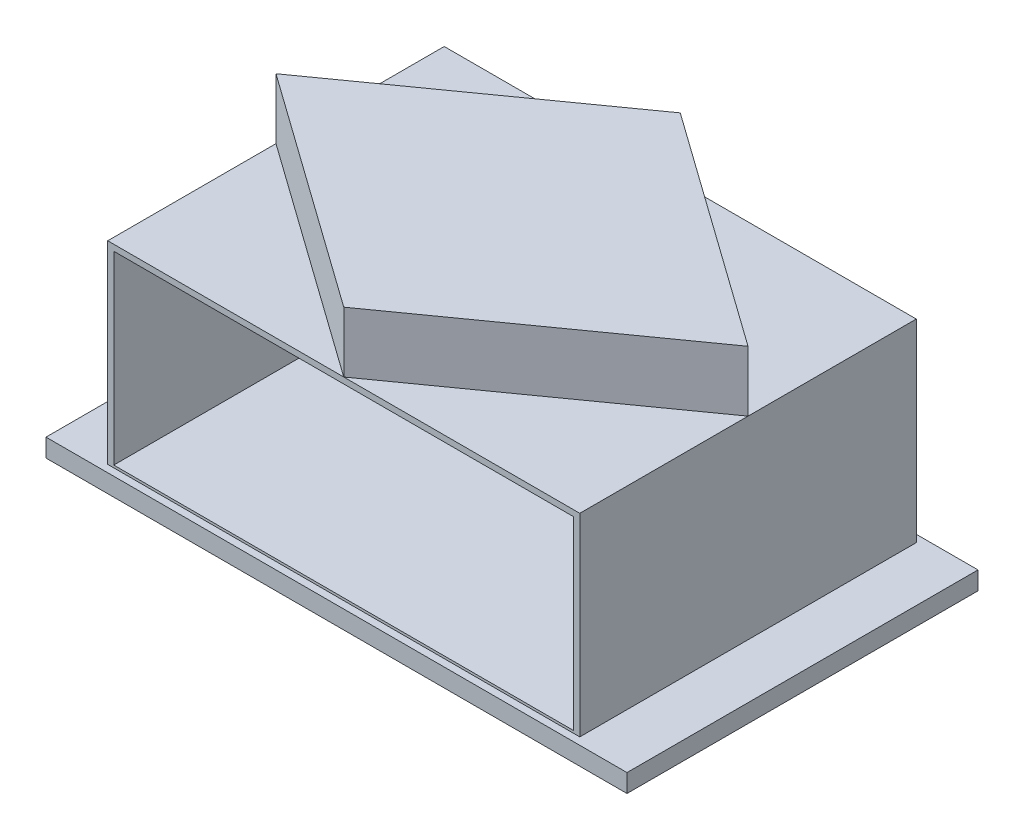
ISO-10303-21;
HEADER;
FILE_DESCRIPTION(('STEP AP214'),'2;1');
FILE_NAME('part.step','',(''),(''),'','','');
FILE_SCHEMA(('AUTOMOTIVE_DESIGN { 1 0 10303 214 1 1 1 1 }'));
ENDSEC;
DATA;
#1=APPLICATION_CONTEXT('core data for automotive mechanical design processes');
#2=APPLICATION_PROTOCOL_DEFINITION('international standard','automotive_design',2000,#1);
#3=PRODUCT_CONTEXT('',#1,'mechanical');
#4=PRODUCT('Part','Part','',(#3));
#5=PRODUCT_RELATED_PRODUCT_CATEGORY('part','',(#4));
#6=PRODUCT_DEFINITION_FORMATION('','',#4);
#7=PRODUCT_DEFINITION_CONTEXT('part definition',#1,'design');
#8=PRODUCT_DEFINITION('design','',#6,#7);
#9=PRODUCT_DEFINITION_SHAPE('','',#8);
#10=(LENGTH_UNIT() NAMED_UNIT(*) SI_UNIT(.MILLI.,.METRE.));
#11=(NAMED_UNIT(*) PLANE_ANGLE_UNIT() SI_UNIT($,.RADIAN.));
#12=(NAMED_UNIT(*) SI_UNIT($,.STERADIAN.) SOLID_ANGLE_UNIT());
#13=UNCERTAINTY_MEASURE_WITH_UNIT(LENGTH_MEASURE(1.E-05),#10,'distance_accuracy_value','');
#14=(GEOMETRIC_REPRESENTATION_CONTEXT(3) GLOBAL_UNCERTAINTY_ASSIGNED_CONTEXT((#13)) GLOBAL_UNIT_ASSIGNED_CONTEXT((#10,
#11,#12)) REPRESENTATION_CONTEXT('',''));
#15=CARTESIAN_POINT('',(0.,0.,0.));
#16=DIRECTION('',(0.,0.,1.));
#17=DIRECTION('',(1.,0.,0.));
#18=AXIS2_PLACEMENT_3D('',#15,#16,#17);
#19=CARTESIAN_POINT('',(0.,160.,0.));
#20=DIRECTION('',(0.,-1.,0.));
#21=DIRECTION('',(0.,0.,-1.));
#22=AXIS2_PLACEMENT_3D('',#19,#20,#21);
#23=PLANE('',#22);
#24=DIRECTION('',(-0.814297396356069,0.,-0.580447887658942));
#25=VECTOR('',#24,1.);
#26=CARTESIAN_POINT('',(195.,160.,0.));
#27=LINE('',#26,#25);
#28=CARTESIAN_POINT('',(195.,160.,0.));
#29=VERTEX_POINT('',#28);
#30=CARTESIAN_POINT('',(0.,160.,-139.));
#31=VERTEX_POINT('',#30);
#32=EDGE_CURVE('E179',#29,#31,#27,.T.);
#33=ORIENTED_EDGE('',*,*,#32,.F.);
#34=DIRECTION('',(0.,0.,-1.));
#35=VECTOR('',#34,1.);
#36=CARTESIAN_POINT('',(195.,160.,39.));
#37=LINE('',#36,#35);
#38=CARTESIAN_POINT('',(195.,160.,-139.));
#39=VERTEX_POINT('',#38);
#40=EDGE_CURVE('E234',#29,#39,#37,.T.);
#41=ORIENTED_EDGE('',*,*,#40,.T.);
#42=DIRECTION('',(-1.,0.,0.));
#43=VECTOR('',#42,1.);
#44=CARTESIAN_POINT('',(-195.,160.,-139.));
#45=LINE('',#44,#43);
#46=EDGE_CURVE('E235',#39,#31,#45,.T.);
#47=ORIENTED_EDGE('',*,*,#46,.T.);
#48=EDGE_LOOP('',(#33,#41,#47));
#49=FACE_BOUND('',#48,.T.);
#50=ADVANCED_FACE('F41',(#49),#23,.F.);
#51=DIRECTION('',(0.814297396356069,0.,-0.580447887658942));
#52=VECTOR('',#51,1.);
#53=CARTESIAN_POINT('',(0.,160.,139.));
#54=LINE('',#53,#52);
#55=CARTESIAN_POINT('',(1.11022302462516E-13,160.,139.));
#56=VERTEX_POINT('',#55);
#57=EDGE_CURVE('E58',#56,#29,#54,.T.);
#58=ORIENTED_EDGE('',*,*,#57,.F.);
#59=DIRECTION('',(-1.,0.,0.));
#60=VECTOR('',#59,1.);
#61=CARTESIAN_POINT('',(195.,160.,139.));
#62=LINE('',#61,#60);
#63=CARTESIAN_POINT('',(195.,160.,139.));
#64=VERTEX_POINT('',#63);
#65=EDGE_CURVE('E218',#64,#56,#62,.T.);
#66=ORIENTED_EDGE('',*,*,#65,.F.);
#67=EDGE_CURVE('E231',#64,#29,#37,.T.);
#68=ORIENTED_EDGE('',*,*,#67,.T.);
#69=EDGE_LOOP('',(#58,#66,#68));
#70=FACE_BOUND('',#69,.T.);
#71=ADVANCED_FACE('F307',(#70),#23,.F.);
#72=DIRECTION('',(0.814297396356069,0.,0.580447887658942));
#73=VECTOR('',#72,1.);
#74=CARTESIAN_POINT('',(-195.,160.,0.));
#75=LINE('',#74,#73);
#76=CARTESIAN_POINT('',(-195.,160.,0.));
#77=VERTEX_POINT('',#76);
#78=EDGE_CURVE('E331',#77,#56,#75,.T.);
#79=ORIENTED_EDGE('',*,*,#78,.F.);
#80=DIRECTION('',(0.,0.,1.));
#81=VECTOR('',#80,1.);
#82=CARTESIAN_POINT('',(-195.,160.,39.));
#83=LINE('',#82,#81);
#84=CARTESIAN_POINT('',(-195.,160.,139.));
#85=VERTEX_POINT('',#84);
#86=EDGE_CURVE('E238',#77,#85,#83,.T.);
#87=ORIENTED_EDGE('',*,*,#86,.T.);
#88=EDGE_CURVE('E211',#56,#85,#62,.T.);
#89=ORIENTED_EDGE('',*,*,#88,.F.);
#90=EDGE_LOOP('',(#79,#87,#89));
#91=FACE_BOUND('',#90,.T.);
#92=ADVANCED_FACE('F315',(#91),#23,.F.);
#93=DIRECTION('',(-0.814297396356069,0.,0.580447887658942));
#94=VECTOR('',#93,1.);
#95=CARTESIAN_POINT('',(0.,160.,-139.));
#96=LINE('',#95,#94);
#97=EDGE_CURVE('E66',#31,#77,#96,.T.);
#98=ORIENTED_EDGE('',*,*,#97,.F.);
#99=CARTESIAN_POINT('',(-195.,160.,-139.));
#100=VERTEX_POINT('',#99);
#101=EDGE_CURVE('E233',#31,#100,#45,.T.);
#102=ORIENTED_EDGE('',*,*,#101,.T.);
#103=EDGE_CURVE('E239',#100,#77,#83,.T.);
#104=ORIENTED_EDGE('',*,*,#103,.T.);
#105=EDGE_LOOP('',(#98,#102,#104));
#106=FACE_BOUND('',#105,.T.);
#107=ADVANCED_FACE('F310',(#106),#23,.F.);
#108=CARTESIAN_POINT('',(0.,0.,0.));
#109=DIRECTION('',(0.,-1.,0.));
#110=DIRECTION('',(0.,0.,-1.));
#111=AXIS2_PLACEMENT_3D('',#108,#109,#110);
#112=PLANE('',#111);
#113=DIRECTION('',(0.,0.,-1.));
#114=VECTOR('',#113,1.);
#115=CARTESIAN_POINT('',(240.,0.,145.));
#116=LINE('',#115,#114);
#117=CARTESIAN_POINT('',(240.,0.,145.));
#118=VERTEX_POINT('',#117);
#119=CARTESIAN_POINT('',(240.,0.,-145.));
#120=VERTEX_POINT('',#119);
#121=EDGE_CURVE('E254',#118,#120,#116,.T.);
#122=ORIENTED_EDGE('',*,*,#121,.T.);
#123=DIRECTION('',(-1.,0.,0.));
#124=VECTOR('',#123,1.);
#125=CARTESIAN_POINT('',(-240.,0.,-145.));
#126=LINE('',#125,#124);
#127=CARTESIAN_POINT('',(-240.,0.,-145.));
#128=VERTEX_POINT('',#127);
#129=EDGE_CURVE('E270',#120,#128,#126,.T.);
#130=ORIENTED_EDGE('',*,*,#129,.T.);
#131=DIRECTION('',(0.,0.,1.));
#132=VECTOR('',#131,1.);
#133=CARTESIAN_POINT('',(-240.,0.,145.));
#134=LINE('',#133,#132);
#135=CARTESIAN_POINT('',(-240.,0.,145.));
#136=VERTEX_POINT('',#135);
#137=EDGE_CURVE('E273',#128,#136,#134,.T.);
#138=ORIENTED_EDGE('',*,*,#137,.T.);
#139=DIRECTION('',(1.,0.,0.));
#140=VECTOR('',#139,1.);
#141=CARTESIAN_POINT('',(-240.,0.,145.));
#142=LINE('',#141,#140);
#143=EDGE_CURVE('E259',#136,#118,#142,.T.);
#144=ORIENTED_EDGE('',*,*,#143,.T.);
#145=EDGE_LOOP('',(#122,#130,#138,#144));
#146=FACE_BOUND('',#145,.T.);
#147=DIRECTION('',(1.,0.,0.));
#148=VECTOR('',#147,1.);
#149=CARTESIAN_POINT('',(-195.,0.,139.));
#150=LINE('',#149,#148);
#151=CARTESIAN_POINT('',(-195.,0.,139.));
#152=VERTEX_POINT('',#151);
#153=CARTESIAN_POINT('',(195.,0.,139.));
#154=VERTEX_POINT('',#153);
#155=EDGE_CURVE('E224',#152,#154,#150,.T.);
#156=ORIENTED_EDGE('',*,*,#155,.F.);
#157=DIRECTION('',(0.,0.,1.));
#158=VECTOR('',#157,1.);
#159=CARTESIAN_POINT('',(-195.,0.,39.));
#160=LINE('',#159,#158);
#161=CARTESIAN_POINT('',(-195.,0.,-139.));
#162=VERTEX_POINT('',#161);
#163=EDGE_CURVE('E247',#162,#152,#160,.T.);
#164=ORIENTED_EDGE('',*,*,#163,.F.);
#165=DIRECTION('',(-1.,0.,0.));
#166=VECTOR('',#165,1.);
#167=CARTESIAN_POINT('',(-195.,0.,-139.));
#168=LINE('',#167,#166);
#169=CARTESIAN_POINT('',(195.,0.,-139.));
#170=VERTEX_POINT('',#169);
#171=EDGE_CURVE('E244',#170,#162,#168,.T.);
#172=ORIENTED_EDGE('',*,*,#171,.F.);
#173=DIRECTION('',(0.,0.,-1.));
#174=VECTOR('',#173,1.);
#175=CARTESIAN_POINT('',(195.,0.,39.));
#176=LINE('',#175,#174);
#177=EDGE_CURVE('E230',#154,#170,#176,.T.);
#178=ORIENTED_EDGE('',*,*,#177,.F.);
#179=EDGE_LOOP('',(#156,#164,#172,#178));
#180=FACE_BOUND('',#179,.T.);
#181=ADVANCED_FACE('F288',(#146,#180),#112,.F.);
#182=CARTESIAN_POINT('',(240.,-15.,145.));
#183=DIRECTION('',(1.,0.,0.));
#184=DIRECTION('',(0.,0.,-1.));
#185=AXIS2_PLACEMENT_3D('',#182,#183,#184);
#186=PLANE('',#185);
#187=ORIENTED_EDGE('',*,*,#121,.F.);
#188=DIRECTION('',(0.,1.,0.));
#189=VECTOR('',#188,1.);
#190=CARTESIAN_POINT('',(240.,-15.,145.));
#191=LINE('',#190,#189);
#192=CARTESIAN_POINT('',(240.,-15.,145.));
#193=VERTEX_POINT('',#192);
#194=EDGE_CURVE('E11',#193,#118,#191,.T.);
#195=ORIENTED_EDGE('',*,*,#194,.F.);
#196=DIRECTION('',(0.,0.,-1.));
#197=VECTOR('',#196,1.);
#198=CARTESIAN_POINT('',(240.,-15.,145.));
#199=LINE('',#198,#197);
#200=CARTESIAN_POINT('',(240.,-15.,-145.));
#201=VERTEX_POINT('',#200);
#202=EDGE_CURVE('E255',#193,#201,#199,.T.);
#203=ORIENTED_EDGE('',*,*,#202,.T.);
#204=DIRECTION('',(0.,1.,0.));
#205=VECTOR('',#204,1.);
#206=CARTESIAN_POINT('',(240.,-15.,-145.));
#207=LINE('',#206,#205);
#208=EDGE_CURVE('E45',#201,#120,#207,.T.);
#209=ORIENTED_EDGE('',*,*,#208,.T.);
#210=EDGE_LOOP('',(#187,#195,#203,#209));
#211=FACE_BOUND('',#210,.T.);
#212=ADVANCED_FACE('F43',(#211),#186,.T.);
#213=CARTESIAN_POINT('',(-240.,-15.,145.));
#214=DIRECTION('',(0.,0.,1.));
#215=DIRECTION('',(1.,0.,0.));
#216=AXIS2_PLACEMENT_3D('',#213,#214,#215);
#217=PLANE('',#216);
#218=ORIENTED_EDGE('',*,*,#143,.F.);
#219=DIRECTION('',(0.,1.,0.));
#220=VECTOR('',#219,1.);
#221=CARTESIAN_POINT('',(-240.,-15.,145.));
#222=LINE('',#221,#220);
#223=CARTESIAN_POINT('',(-240.,-15.,145.));
#224=VERTEX_POINT('',#223);
#225=EDGE_CURVE('E50',#224,#136,#222,.T.);
#226=ORIENTED_EDGE('',*,*,#225,.F.);
#227=DIRECTION('',(1.,0.,0.));
#228=VECTOR('',#227,1.);
#229=CARTESIAN_POINT('',(-240.,-15.,145.));
#230=LINE('',#229,#228);
#231=EDGE_CURVE('E265',#224,#193,#230,.T.);
#232=ORIENTED_EDGE('',*,*,#231,.T.);
#233=ORIENTED_EDGE('',*,*,#194,.T.);
#234=EDGE_LOOP('',(#218,#226,#232,#233));
#235=FACE_BOUND('',#234,.T.);
#236=ADVANCED_FACE('F292',(#235),#217,.T.);
#237=CARTESIAN_POINT('',(-240.,-15.,145.));
#238=DIRECTION('',(-1.,0.,0.));
#239=DIRECTION('',(0.,0.,1.));
#240=AXIS2_PLACEMENT_3D('',#237,#238,#239);
#241=PLANE('',#240);
#242=ORIENTED_EDGE('',*,*,#137,.F.);
#243=DIRECTION('',(0.,1.,0.));
#244=VECTOR('',#243,1.);
#245=CARTESIAN_POINT('',(-240.,-15.,-145.));
#246=LINE('',#245,#244);
#247=CARTESIAN_POINT('',(-240.,-15.,-145.));
#248=VERTEX_POINT('',#247);
#249=EDGE_CURVE('E278',#248,#128,#246,.T.);
#250=ORIENTED_EDGE('',*,*,#249,.F.);
#251=DIRECTION('',(0.,0.,1.));
#252=VECTOR('',#251,1.);
#253=CARTESIAN_POINT('',(-240.,-15.,145.));
#254=LINE('',#253,#252);
#255=EDGE_CURVE('E262',#248,#224,#254,.T.);
#256=ORIENTED_EDGE('',*,*,#255,.T.);
#257=ORIENTED_EDGE('',*,*,#225,.T.);
#258=EDGE_LOOP('',(#242,#250,#256,#257));
#259=FACE_BOUND('',#258,.T.);
#260=ADVANCED_FACE('F298',(#259),#241,.T.);
#261=CARTESIAN_POINT('',(-240.,-15.,-145.));
#262=DIRECTION('',(0.,0.,-1.));
#263=DIRECTION('',(-1.,0.,0.));
#264=AXIS2_PLACEMENT_3D('',#261,#262,#263);
#265=PLANE('',#264);
#266=ORIENTED_EDGE('',*,*,#129,.F.);
#267=ORIENTED_EDGE('',*,*,#208,.F.);
#268=DIRECTION('',(-1.,0.,0.));
#269=VECTOR('',#268,1.);
#270=CARTESIAN_POINT('',(-240.,-15.,-145.));
#271=LINE('',#270,#269);
#272=EDGE_CURVE('E258',#201,#248,#271,.T.);
#273=ORIENTED_EDGE('',*,*,#272,.T.);
#274=ORIENTED_EDGE('',*,*,#249,.T.);
#275=EDGE_LOOP('',(#266,#267,#273,#274));
#276=FACE_BOUND('',#275,.T.);
#277=ADVANCED_FACE('F286',(#276),#265,.T.);
#278=CARTESIAN_POINT('',(0.,-15.,0.));
#279=DIRECTION('',(0.,-1.,0.));
#280=DIRECTION('',(0.,0.,-1.));
#281=AXIS2_PLACEMENT_3D('',#278,#279,#280);
#282=PLANE('',#281);
#283=ORIENTED_EDGE('',*,*,#202,.F.);
#284=ORIENTED_EDGE('',*,*,#231,.F.);
#285=ORIENTED_EDGE('',*,*,#255,.F.);
#286=ORIENTED_EDGE('',*,*,#272,.F.);
#287=EDGE_LOOP('',(#283,#284,#285,#286));
#288=FACE_BOUND('',#287,.T.);
#289=ADVANCED_FACE('F295',(#288),#282,.T.);
#290=CARTESIAN_POINT('',(195.,160.,39.));
#291=DIRECTION('',(-1.,0.,0.));
#292=DIRECTION('',(0.,0.,1.));
#293=AXIS2_PLACEMENT_3D('',#290,#291,#292);
#294=PLANE('',#293);
#295=ORIENTED_EDGE('',*,*,#177,.T.);
#296=DIRECTION('',(0.,-1.,0.));
#297=VECTOR('',#296,1.);
#298=CARTESIAN_POINT('',(195.,160.,-139.));
#299=LINE('',#298,#297);
#300=EDGE_CURVE('E251',#39,#170,#299,.T.);
#301=ORIENTED_EDGE('',*,*,#300,.F.);
#302=ORIENTED_EDGE('',*,*,#40,.F.);
#303=ORIENTED_EDGE('',*,*,#67,.F.);
#304=DIRECTION('',(0.,1.,0.));
#305=VECTOR('',#304,1.);
#306=CARTESIAN_POINT('',(195.,0.,139.));
#307=LINE('',#306,#305);
#308=EDGE_CURVE('E227',#154,#64,#307,.T.);
#309=ORIENTED_EDGE('',*,*,#308,.F.);
#310=EDGE_LOOP('',(#295,#301,#302,#303,#309));
#311=FACE_BOUND('',#310,.T.);
#312=ADVANCED_FACE('F395',(#311),#294,.F.);
#313=CARTESIAN_POINT('',(-195.,160.,-139.));
#314=DIRECTION('',(0.,0.,1.));
#315=DIRECTION('',(1.,0.,0.));
#316=AXIS2_PLACEMENT_3D('',#313,#314,#315);
#317=PLANE('',#316);
#318=ORIENTED_EDGE('',*,*,#171,.T.);
#319=DIRECTION('',(0.,-1.,0.));
#320=VECTOR('',#319,1.);
#321=CARTESIAN_POINT('',(-195.,160.,-139.));
#322=LINE('',#321,#320);
#323=EDGE_CURVE('E241',#100,#162,#322,.T.);
#324=ORIENTED_EDGE('',*,*,#323,.F.);
#325=ORIENTED_EDGE('',*,*,#101,.F.);
#326=ORIENTED_EDGE('',*,*,#46,.F.);
#327=ORIENTED_EDGE('',*,*,#300,.T.);
#328=EDGE_LOOP('',(#318,#324,#325,#326,#327));
#329=FACE_BOUND('',#328,.T.);
#330=ADVANCED_FACE('F386',(#329),#317,.F.);
#331=CARTESIAN_POINT('',(-195.,160.,39.));
#332=DIRECTION('',(1.,0.,0.));
#333=DIRECTION('',(0.,0.,-1.));
#334=AXIS2_PLACEMENT_3D('',#331,#332,#333);
#335=PLANE('',#334);
#336=ORIENTED_EDGE('',*,*,#163,.T.);
#337=DIRECTION('',(0.,-1.,0.));
#338=VECTOR('',#337,1.);
#339=CARTESIAN_POINT('',(-195.,160.,139.));
#340=LINE('',#339,#338);
#341=EDGE_CURVE('E221',#85,#152,#340,.T.);
#342=ORIENTED_EDGE('',*,*,#341,.F.);
#343=ORIENTED_EDGE('',*,*,#86,.F.);
#344=ORIENTED_EDGE('',*,*,#103,.F.);
#345=ORIENTED_EDGE('',*,*,#323,.T.);
#346=EDGE_LOOP('',(#336,#342,#343,#344,#345));
#347=FACE_BOUND('',#346,.T.);
#348=ADVANCED_FACE('F381',(#347),#335,.F.);
#349=CARTESIAN_POINT('',(0.,0.,139.));
#350=DIRECTION('',(0.,0.,1.));
#351=DIRECTION('',(1.,0.,0.));
#352=AXIS2_PLACEMENT_3D('',#349,#350,#351);
#353=PLANE('',#352);
#354=DIRECTION('',(0.,-1.,0.));
#355=VECTOR('',#354,1.);
#356=CARTESIAN_POINT('',(-190.,1.99999999999995,139.));
#357=LINE('',#356,#355);
#358=CARTESIAN_POINT('',(-190.,155.,139.));
#359=VERTEX_POINT('',#358);
#360=CARTESIAN_POINT('',(-190.,1.99999999999995,139.));
#361=VERTEX_POINT('',#360);
#362=EDGE_CURVE('E180',#359,#361,#357,.T.);
#363=ORIENTED_EDGE('',*,*,#362,.F.);
#364=DIRECTION('',(-1.,0.,0.));
#365=VECTOR('',#364,1.);
#366=CARTESIAN_POINT('',(-190.,155.,139.));
#367=LINE('',#366,#365);
#368=CARTESIAN_POINT('',(190.,155.,139.));
#369=VERTEX_POINT('',#368);
#370=EDGE_CURVE('E192',#369,#359,#367,.T.);
#371=ORIENTED_EDGE('',*,*,#370,.F.);
#372=DIRECTION('',(0.,1.,0.));
#373=VECTOR('',#372,1.);
#374=CARTESIAN_POINT('',(190.,155.,139.));
#375=LINE('',#374,#373);
#376=CARTESIAN_POINT('',(190.,2.,139.));
#377=VERTEX_POINT('',#376);
#378=EDGE_CURVE('E204',#377,#369,#375,.T.);
#379=ORIENTED_EDGE('',*,*,#378,.F.);
#380=DIRECTION('',(1.,0.,0.));
#381=VECTOR('',#380,1.);
#382=CARTESIAN_POINT('',(190.,2.,139.));
#383=LINE('',#382,#381);
#384=EDGE_CURVE('E182',#361,#377,#383,.T.);
#385=ORIENTED_EDGE('',*,*,#384,.F.);
#386=EDGE_LOOP('',(#363,#371,#379,#385));
#387=FACE_BOUND('',#386,.T.);
#388=ORIENTED_EDGE('',*,*,#65,.T.);
#389=ORIENTED_EDGE('',*,*,#88,.T.);
#390=ORIENTED_EDGE('',*,*,#341,.T.);
#391=ORIENTED_EDGE('',*,*,#155,.T.);
#392=ORIENTED_EDGE('',*,*,#308,.T.);
#393=EDGE_LOOP('',(#388,#389,#390,#391,#392));
#394=FACE_BOUND('',#393,.T.);
#395=ADVANCED_FACE('F378',(#387,#394),#353,.T.);
#396=CARTESIAN_POINT('',(-190.,1.99999999999995,-101.));
#397=DIRECTION('',(-1.,0.,0.));
#398=DIRECTION('',(0.,0.,1.));
#399=AXIS2_PLACEMENT_3D('',#396,#397,#398);
#400=PLANE('',#399);
#401=ORIENTED_EDGE('',*,*,#362,.T.);
#402=DIRECTION('',(0.,0.,1.));
#403=VECTOR('',#402,1.);
#404=CARTESIAN_POINT('',(-190.,1.99999999999995,-101.));
#405=LINE('',#404,#403);
#406=CARTESIAN_POINT('',(-190.,1.99999999999995,-101.));
#407=VERTEX_POINT('',#406);
#408=EDGE_CURVE('E200',#407,#361,#405,.T.);
#409=ORIENTED_EDGE('',*,*,#408,.F.);
#410=DIRECTION('',(0.,-1.,0.));
#411=VECTOR('',#410,1.);
#412=CARTESIAN_POINT('',(-190.,1.99999999999995,-101.));
#413=LINE('',#412,#411);
#414=CARTESIAN_POINT('',(-190.,155.,-101.));
#415=VERTEX_POINT('',#414);
#416=EDGE_CURVE('E188',#415,#407,#413,.T.);
#417=ORIENTED_EDGE('',*,*,#416,.F.);
#418=DIRECTION('',(0.,0.,1.));
#419=VECTOR('',#418,1.);
#420=CARTESIAN_POINT('',(-190.,155.,-101.));
#421=LINE('',#420,#419);
#422=EDGE_CURVE('E209',#415,#359,#421,.T.);
#423=ORIENTED_EDGE('',*,*,#422,.T.);
#424=EDGE_LOOP('',(#401,#409,#417,#423));
#425=FACE_BOUND('',#424,.T.);
#426=ADVANCED_FACE('F369',(#425),#400,.F.);
#427=CARTESIAN_POINT('',(-190.,155.,-101.));
#428=DIRECTION('',(0.,1.,0.));
#429=DIRECTION('',(0.,0.,1.));
#430=AXIS2_PLACEMENT_3D('',#427,#428,#429);
#431=PLANE('',#430);
#432=ORIENTED_EDGE('',*,*,#370,.T.);
#433=ORIENTED_EDGE('',*,*,#422,.F.);
#434=DIRECTION('',(-1.,0.,0.));
#435=VECTOR('',#434,1.);
#436=CARTESIAN_POINT('',(-190.,155.,-101.));
#437=LINE('',#436,#435);
#438=CARTESIAN_POINT('',(190.,155.,-101.));
#439=VERTEX_POINT('',#438);
#440=EDGE_CURVE('E198',#439,#415,#437,.T.);
#441=ORIENTED_EDGE('',*,*,#440,.F.);
#442=DIRECTION('',(0.,0.,1.));
#443=VECTOR('',#442,1.);
#444=CARTESIAN_POINT('',(190.,155.,-101.));
#445=LINE('',#444,#443);
#446=EDGE_CURVE('E212',#439,#369,#445,.T.);
#447=ORIENTED_EDGE('',*,*,#446,.T.);
#448=EDGE_LOOP('',(#432,#433,#441,#447));
#449=FACE_BOUND('',#448,.T.);
#450=ADVANCED_FACE('F365',(#449),#431,.F.);
#451=CARTESIAN_POINT('',(190.,155.,-101.));
#452=DIRECTION('',(1.,0.,0.));
#453=DIRECTION('',(0.,0.,-1.));
#454=AXIS2_PLACEMENT_3D('',#451,#452,#453);
#455=PLANE('',#454);
#456=ORIENTED_EDGE('',*,*,#378,.T.);
#457=ORIENTED_EDGE('',*,*,#446,.F.);
#458=DIRECTION('',(0.,1.,0.));
#459=VECTOR('',#458,1.);
#460=CARTESIAN_POINT('',(190.,155.,-101.));
#461=LINE('',#460,#459);
#462=CARTESIAN_POINT('',(190.,2.,-101.));
#463=VERTEX_POINT('',#462);
#464=EDGE_CURVE('E195',#463,#439,#461,.T.);
#465=ORIENTED_EDGE('',*,*,#464,.F.);
#466=DIRECTION('',(0.,0.,1.));
#467=VECTOR('',#466,1.);
#468=CARTESIAN_POINT('',(190.,2.,-101.));
#469=LINE('',#468,#467);
#470=EDGE_CURVE('E214',#463,#377,#469,.T.);
#471=ORIENTED_EDGE('',*,*,#470,.T.);
#472=EDGE_LOOP('',(#456,#457,#465,#471));
#473=FACE_BOUND('',#472,.T.);
#474=ADVANCED_FACE('F368',(#473),#455,.F.);
#475=CARTESIAN_POINT('',(190.,2.,-101.));
#476=DIRECTION('',(0.,-1.,0.));
#477=DIRECTION('',(1.,0.,0.));
#478=AXIS2_PLACEMENT_3D('',#475,#476,#477);
#479=PLANE('',#478);
#480=ORIENTED_EDGE('',*,*,#384,.T.);
#481=ORIENTED_EDGE('',*,*,#470,.F.);
#482=DIRECTION('',(1.,0.,0.));
#483=VECTOR('',#482,1.);
#484=CARTESIAN_POINT('',(190.,2.,-101.));
#485=LINE('',#484,#483);
#486=EDGE_CURVE('E191',#407,#463,#485,.T.);
#487=ORIENTED_EDGE('',*,*,#486,.F.);
#488=ORIENTED_EDGE('',*,*,#408,.T.);
#489=EDGE_LOOP('',(#480,#481,#487,#488));
#490=FACE_BOUND('',#489,.T.);
#491=ADVANCED_FACE('F363',(#490),#479,.F.);
#492=CARTESIAN_POINT('',(0.,0.,-101.));
#493=DIRECTION('',(0.,0.,-1.));
#494=DIRECTION('',(-1.,0.,0.));
#495=AXIS2_PLACEMENT_3D('',#492,#493,#494);
#496=PLANE('',#495);
#497=ORIENTED_EDGE('',*,*,#416,.T.);
#498=ORIENTED_EDGE('',*,*,#486,.T.);
#499=ORIENTED_EDGE('',*,*,#464,.T.);
#500=ORIENTED_EDGE('',*,*,#440,.T.);
#501=EDGE_LOOP('',(#497,#498,#499,#500));
#502=FACE_BOUND('',#501,.T.);
#503=ADVANCED_FACE('F361',(#502),#496,.F.);
#504=CARTESIAN_POINT('',(195.,210.,0.));
#505=DIRECTION('',(-0.580447887658942,0.,0.814297396356069));
#506=DIRECTION('',(0.814297396356069,0.,0.580447887658942));
#507=AXIS2_PLACEMENT_3D('',#504,#505,#506);
#508=PLANE('',#507);
#509=ORIENTED_EDGE('',*,*,#32,.T.);
#510=DIRECTION('',(0.,-1.,0.));
#511=VECTOR('',#510,1.);
#512=CARTESIAN_POINT('',(0.,210.,-139.));
#513=LINE('',#512,#511);
#514=CARTESIAN_POINT('',(0.,210.,-139.));
#515=VERTEX_POINT('',#514);
#516=EDGE_CURVE('E161',#515,#31,#513,.T.);
#517=ORIENTED_EDGE('',*,*,#516,.F.);
#518=DIRECTION('',(-0.814297396356069,0.,-0.580447887658942));
#519=VECTOR('',#518,1.);
#520=CARTESIAN_POINT('',(195.,210.,0.));
#521=LINE('',#520,#519);
#522=CARTESIAN_POINT('',(195.,210.,0.));
#523=VERTEX_POINT('',#522);
#524=EDGE_CURVE('E168',#523,#515,#521,.T.);
#525=ORIENTED_EDGE('',*,*,#524,.F.);
#526=DIRECTION('',(0.,-1.,0.));
#527=VECTOR('',#526,1.);
#528=CARTESIAN_POINT('',(195.,210.,0.));
#529=LINE('',#528,#527);
#530=EDGE_CURVE('E341',#523,#29,#529,.T.);
#531=ORIENTED_EDGE('',*,*,#530,.T.);
#532=EDGE_LOOP('',(#509,#517,#525,#531));
#533=FACE_BOUND('',#532,.T.);
#534=ADVANCED_FACE('F178',(#533),#508,.F.);
#535=CARTESIAN_POINT('',(0.,210.,-139.));
#536=DIRECTION('',(0.580447887658942,0.,0.814297396356069));
#537=DIRECTION('',(0.814297396356069,0.,-0.580447887658942));
#538=AXIS2_PLACEMENT_3D('',#535,#536,#537);
#539=PLANE('',#538);
#540=ORIENTED_EDGE('',*,*,#97,.T.);
#541=DIRECTION('',(0.,-1.,0.));
#542=VECTOR('',#541,1.);
#543=CARTESIAN_POINT('',(-195.,210.,0.));
#544=LINE('',#543,#542);
#545=CARTESIAN_POINT('',(-195.,210.,0.));
#546=VERTEX_POINT('',#545);
#547=EDGE_CURVE('E164',#546,#77,#544,.T.);
#548=ORIENTED_EDGE('',*,*,#547,.F.);
#549=DIRECTION('',(-0.814297396356069,0.,0.580447887658942));
#550=VECTOR('',#549,1.);
#551=CARTESIAN_POINT('',(0.,210.,-139.));
#552=LINE('',#551,#550);
#553=EDGE_CURVE('E157',#515,#546,#552,.T.);
#554=ORIENTED_EDGE('',*,*,#553,.F.);
#555=ORIENTED_EDGE('',*,*,#516,.T.);
#556=EDGE_LOOP('',(#540,#548,#554,#555));
#557=FACE_BOUND('',#556,.T.);
#558=ADVANCED_FACE('F159',(#557),#539,.F.);
#559=CARTESIAN_POINT('',(-195.,210.,0.));
#560=DIRECTION('',(0.580447887658942,0.,-0.814297396356069));
#561=DIRECTION('',(-0.814297396356069,0.,-0.580447887658942));
#562=AXIS2_PLACEMENT_3D('',#559,#560,#561);
#563=PLANE('',#562);
#564=ORIENTED_EDGE('',*,*,#78,.T.);
#565=DIRECTION('',(0.,-1.,0.));
#566=VECTOR('',#565,1.);
#567=CARTESIAN_POINT('',(0.,210.,139.));
#568=LINE('',#567,#566);
#569=CARTESIAN_POINT('',(0.,210.,139.));
#570=VERTEX_POINT('',#569);
#571=EDGE_CURVE('E184',#570,#56,#568,.T.);
#572=ORIENTED_EDGE('',*,*,#571,.F.);
#573=DIRECTION('',(0.814297396356069,0.,0.580447887658942));
#574=VECTOR('',#573,1.);
#575=CARTESIAN_POINT('',(-195.,210.,0.));
#576=LINE('',#575,#574);
#577=EDGE_CURVE('E167',#546,#570,#576,.T.);
#578=ORIENTED_EDGE('',*,*,#577,.F.);
#579=ORIENTED_EDGE('',*,*,#547,.T.);
#580=EDGE_LOOP('',(#564,#572,#578,#579));
#581=FACE_BOUND('',#580,.T.);
#582=ADVANCED_FACE('F339',(#581),#563,.F.);
#583=CARTESIAN_POINT('',(0.,210.,139.));
#584=DIRECTION('',(-0.580447887658942,0.,-0.814297396356069));
#585=DIRECTION('',(-0.814297396356069,0.,0.580447887658942));
#586=AXIS2_PLACEMENT_3D('',#583,#584,#585);
#587=PLANE('',#586);
#588=ORIENTED_EDGE('',*,*,#57,.T.);
#589=ORIENTED_EDGE('',*,*,#530,.F.);
#590=DIRECTION('',(0.814297396356069,0.,-0.580447887658942));
#591=VECTOR('',#590,1.);
#592=CARTESIAN_POINT('',(0.,210.,139.));
#593=LINE('',#592,#591);
#594=EDGE_CURVE('E173',#570,#523,#593,.T.);
#595=ORIENTED_EDGE('',*,*,#594,.F.);
#596=ORIENTED_EDGE('',*,*,#571,.T.);
#597=EDGE_LOOP('',(#588,#589,#595,#596));
#598=FACE_BOUND('',#597,.T.);
#599=ADVANCED_FACE('F347',(#598),#587,.F.);
#600=CARTESIAN_POINT('',(0.,210.,0.));
#601=DIRECTION('',(0.,1.,0.));
#602=DIRECTION('',(0.,0.,1.));
#603=AXIS2_PLACEMENT_3D('',#600,#601,#602);
#604=PLANE('',#603);
#605=ORIENTED_EDGE('',*,*,#524,.T.);
#606=ORIENTED_EDGE('',*,*,#553,.T.);
#607=ORIENTED_EDGE('',*,*,#577,.T.);
#608=ORIENTED_EDGE('',*,*,#594,.T.);
#609=EDGE_LOOP('',(#605,#606,#607,#608));
#610=FACE_BOUND('',#609,.T.);
#611=ADVANCED_FACE('F171',(#610),#604,.T.);
#612=CLOSED_SHELL('',(#50,#71,#92,#107,#181,#212,#236,#260,#277,#289,#312,#330,#348,#395,#426,
#450,#474,#491,#503,#534,#558,#582,#599,#611));
#613=MANIFOLD_SOLID_BREP('B2',#612);
#614=ADVANCED_BREP_SHAPE_REPRESENTATION('',(#18,#613),#14);
#615=SHAPE_DEFINITION_REPRESENTATION(#9,#614);
ENDSEC;
END-ISO-10303-21;
